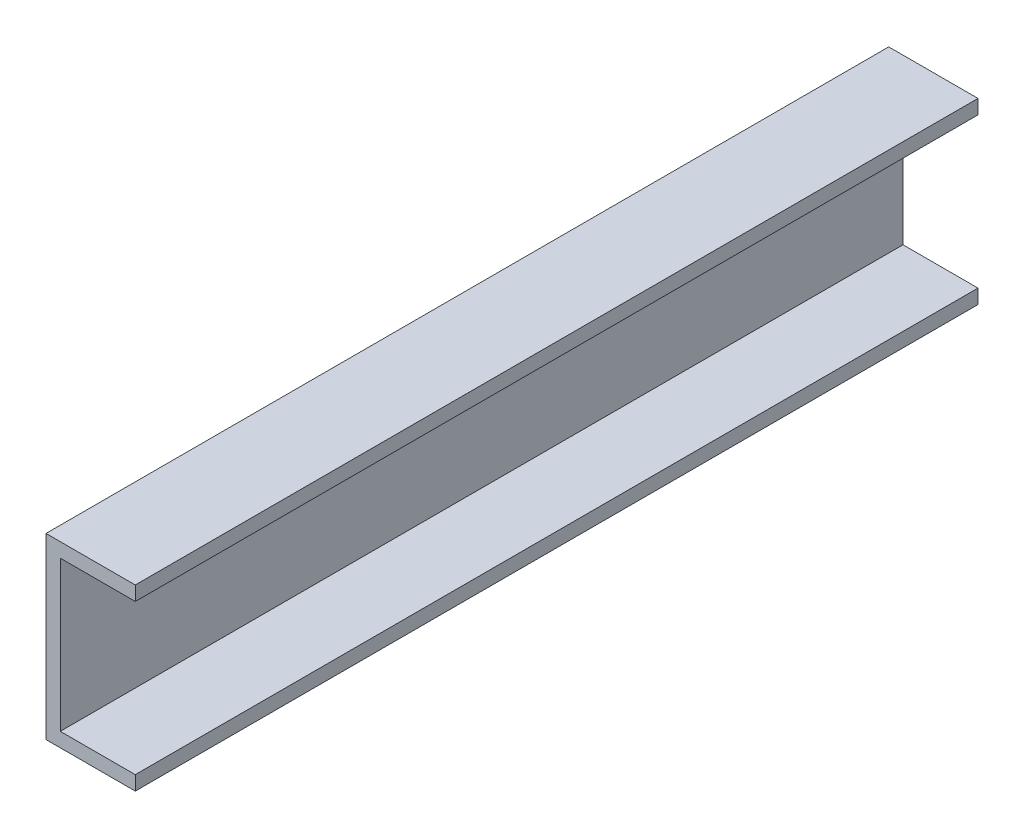
ISO-10303-21;
HEADER;
FILE_DESCRIPTION(('STEP AP214'),'2;1');
FILE_NAME('part.step','',(''),(''),'','','');
FILE_SCHEMA(('AUTOMOTIVE_DESIGN { 1 0 10303 214 1 1 1 1 }'));
ENDSEC;
DATA;
#1=APPLICATION_CONTEXT('core data for automotive mechanical design processes');
#2=APPLICATION_PROTOCOL_DEFINITION('international standard','automotive_design',2000,#1);
#3=PRODUCT_CONTEXT('',#1,'mechanical');
#4=PRODUCT('Part','Part','',(#3));
#5=PRODUCT_RELATED_PRODUCT_CATEGORY('part','',(#4));
#6=PRODUCT_DEFINITION_FORMATION('','',#4);
#7=PRODUCT_DEFINITION_CONTEXT('part definition',#1,'design');
#8=PRODUCT_DEFINITION('design','',#6,#7);
#9=PRODUCT_DEFINITION_SHAPE('','',#8);
#10=(LENGTH_UNIT() NAMED_UNIT(*) SI_UNIT(.MILLI.,.METRE.));
#11=(NAMED_UNIT(*) PLANE_ANGLE_UNIT() SI_UNIT($,.RADIAN.));
#12=(NAMED_UNIT(*) SI_UNIT($,.STERADIAN.) SOLID_ANGLE_UNIT());
#13=UNCERTAINTY_MEASURE_WITH_UNIT(LENGTH_MEASURE(1.E-05),#10,'distance_accuracy_value','');
#14=(GEOMETRIC_REPRESENTATION_CONTEXT(3) GLOBAL_UNCERTAINTY_ASSIGNED_CONTEXT((#13)) GLOBAL_UNIT_ASSIGNED_CONTEXT((#10,
#11,#12)) REPRESENTATION_CONTEXT('',''));
#15=CARTESIAN_POINT('',(0.,0.,0.));
#16=DIRECTION('',(0.,0.,1.));
#17=DIRECTION('',(1.,0.,0.));
#18=AXIS2_PLACEMENT_3D('',#15,#16,#17);
#19=CARTESIAN_POINT('',(0.,0.,472.));
#20=DIRECTION('',(0.,-1.,0.));
#21=DIRECTION('',(0.,0.,-1.));
#22=AXIS2_PLACEMENT_3D('',#19,#20,#21);
#23=PLANE('',#22);
#24=DIRECTION('',(-1.,0.,0.));
#25=VECTOR('',#24,1.);
#26=CARTESIAN_POINT('',(0.,0.,0.));
#27=LINE('',#26,#25);
#28=CARTESIAN_POINT('',(50.,0.,0.));
#29=VERTEX_POINT('',#28);
#30=CARTESIAN_POINT('',(0.,0.,0.));
#31=VERTEX_POINT('',#30);
#32=EDGE_CURVE('E128',#29,#31,#27,.T.);
#33=ORIENTED_EDGE('',*,*,#32,.T.);
#34=DIRECTION('',(0.,0.,-1.));
#35=VECTOR('',#34,1.);
#36=CARTESIAN_POINT('',(0.,0.,472.));
#37=LINE('',#36,#35);
#38=CARTESIAN_POINT('',(0.,0.,472.));
#39=VERTEX_POINT('',#38);
#40=EDGE_CURVE('E11',#39,#31,#37,.T.);
#41=ORIENTED_EDGE('',*,*,#40,.F.);
#42=DIRECTION('',(-1.,0.,0.));
#43=VECTOR('',#42,1.);
#44=CARTESIAN_POINT('',(0.,0.,472.));
#45=LINE('',#44,#43);
#46=CARTESIAN_POINT('',(50.,0.,472.));
#47=VERTEX_POINT('',#46);
#48=EDGE_CURVE('E142',#47,#39,#45,.T.);
#49=ORIENTED_EDGE('',*,*,#48,.F.);
#50=DIRECTION('',(0.,0.,-1.));
#51=VECTOR('',#50,1.);
#52=CARTESIAN_POINT('',(50.,0.,472.));
#53=LINE('',#52,#51);
#54=EDGE_CURVE('E124',#47,#29,#53,.T.);
#55=ORIENTED_EDGE('',*,*,#54,.T.);
#56=EDGE_LOOP('',(#33,#41,#49,#55));
#57=FACE_BOUND('',#56,.T.);
#58=ADVANCED_FACE('F32',(#57),#23,.F.);
#59=CARTESIAN_POINT('',(0.,0.,472.));
#60=DIRECTION('',(1.,0.,0.));
#61=DIRECTION('',(0.,0.,-1.));
#62=AXIS2_PLACEMENT_3D('',#59,#60,#61);
#63=PLANE('',#62);
#64=DIRECTION('',(0.,-1.,0.));
#65=VECTOR('',#64,1.);
#66=CARTESIAN_POINT('',(0.,0.,0.));
#67=LINE('',#66,#65);
#68=CARTESIAN_POINT('',(0.,-100.,0.));
#69=VERTEX_POINT('',#68);
#70=EDGE_CURVE('E131',#31,#69,#67,.T.);
#71=ORIENTED_EDGE('',*,*,#70,.T.);
#72=DIRECTION('',(0.,0.,-1.));
#73=VECTOR('',#72,1.);
#74=CARTESIAN_POINT('',(0.,-100.,472.));
#75=LINE('',#74,#73);
#76=CARTESIAN_POINT('',(0.,-100.,472.));
#77=VERTEX_POINT('',#76);
#78=EDGE_CURVE('E40',#77,#69,#75,.T.);
#79=ORIENTED_EDGE('',*,*,#78,.F.);
#80=DIRECTION('',(0.,-1.,0.));
#81=VECTOR('',#80,1.);
#82=CARTESIAN_POINT('',(0.,0.,472.));
#83=LINE('',#82,#81);
#84=EDGE_CURVE('E91',#39,#77,#83,.T.);
#85=ORIENTED_EDGE('',*,*,#84,.F.);
#86=ORIENTED_EDGE('',*,*,#40,.T.);
#87=EDGE_LOOP('',(#71,#79,#85,#86));
#88=FACE_BOUND('',#87,.T.);
#89=ADVANCED_FACE('F177',(#88),#63,.F.);
#90=CARTESIAN_POINT('',(0.,-100.,472.));
#91=DIRECTION('',(0.,1.,0.));
#92=DIRECTION('',(0.,0.,1.));
#93=AXIS2_PLACEMENT_3D('',#90,#91,#92);
#94=PLANE('',#93);
#95=DIRECTION('',(1.,0.,0.));
#96=VECTOR('',#95,1.);
#97=CARTESIAN_POINT('',(0.,-100.,0.));
#98=LINE('',#97,#96);
#99=CARTESIAN_POINT('',(50.,-100.,0.));
#100=VERTEX_POINT('',#99);
#101=EDGE_CURVE('E133',#69,#100,#98,.T.);
#102=ORIENTED_EDGE('',*,*,#101,.T.);
#103=DIRECTION('',(0.,0.,-1.));
#104=VECTOR('',#103,1.);
#105=CARTESIAN_POINT('',(50.,-100.,472.));
#106=LINE('',#105,#104);
#107=CARTESIAN_POINT('',(50.,-100.,472.));
#108=VERTEX_POINT('',#107);
#109=EDGE_CURVE('E149',#108,#100,#106,.T.);
#110=ORIENTED_EDGE('',*,*,#109,.F.);
#111=DIRECTION('',(1.,0.,0.));
#112=VECTOR('',#111,1.);
#113=CARTESIAN_POINT('',(0.,-100.,472.));
#114=LINE('',#113,#112);
#115=EDGE_CURVE('E157',#77,#108,#114,.T.);
#116=ORIENTED_EDGE('',*,*,#115,.F.);
#117=ORIENTED_EDGE('',*,*,#78,.T.);
#118=EDGE_LOOP('',(#102,#110,#116,#117));
#119=FACE_BOUND('',#118,.T.);
#120=ADVANCED_FACE('F155',(#119),#94,.F.);
#121=CARTESIAN_POINT('',(50.,-100.,472.));
#122=DIRECTION('',(-1.,0.,0.));
#123=DIRECTION('',(0.,0.,1.));
#124=AXIS2_PLACEMENT_3D('',#121,#122,#123);
#125=PLANE('',#124);
#126=DIRECTION('',(0.,1.,0.));
#127=VECTOR('',#126,1.);
#128=CARTESIAN_POINT('',(50.,-100.,0.));
#129=LINE('',#128,#127);
#130=CARTESIAN_POINT('',(50.,-92.,0.));
#131=VERTEX_POINT('',#130);
#132=EDGE_CURVE('E135',#100,#131,#129,.T.);
#133=ORIENTED_EDGE('',*,*,#132,.T.);
#134=DIRECTION('',(0.,0.,-1.));
#135=VECTOR('',#134,1.);
#136=CARTESIAN_POINT('',(50.,-92.,472.));
#137=LINE('',#136,#135);
#138=CARTESIAN_POINT('',(50.,-92.,472.));
#139=VERTEX_POINT('',#138);
#140=EDGE_CURVE('E146',#139,#131,#137,.T.);
#141=ORIENTED_EDGE('',*,*,#140,.F.);
#142=DIRECTION('',(0.,1.,0.));
#143=VECTOR('',#142,1.);
#144=CARTESIAN_POINT('',(50.,-100.,472.));
#145=LINE('',#144,#143);
#146=EDGE_CURVE('E169',#108,#139,#145,.T.);
#147=ORIENTED_EDGE('',*,*,#146,.F.);
#148=ORIENTED_EDGE('',*,*,#109,.T.);
#149=EDGE_LOOP('',(#133,#141,#147,#148));
#150=FACE_BOUND('',#149,.T.);
#151=ADVANCED_FACE('F165',(#150),#125,.F.);
#152=CARTESIAN_POINT('',(50.,-92.,472.));
#153=DIRECTION('',(0.,-1.,0.));
#154=DIRECTION('',(0.,0.,-1.));
#155=AXIS2_PLACEMENT_3D('',#152,#153,#154);
#156=PLANE('',#155);
#157=DIRECTION('',(-1.,0.,0.));
#158=VECTOR('',#157,1.);
#159=CARTESIAN_POINT('',(50.,-92.,0.));
#160=LINE('',#159,#158);
#161=CARTESIAN_POINT('',(8.00000000000001,-92.,0.));
#162=VERTEX_POINT('',#161);
#163=EDGE_CURVE('E137',#131,#162,#160,.T.);
#164=ORIENTED_EDGE('',*,*,#163,.T.);
#165=DIRECTION('',(0.,0.,-1.));
#166=VECTOR('',#165,1.);
#167=CARTESIAN_POINT('',(8.00000000000001,-92.,472.));
#168=LINE('',#167,#166);
#169=CARTESIAN_POINT('',(8.00000000000001,-92.,472.));
#170=VERTEX_POINT('',#169);
#171=EDGE_CURVE('E119',#170,#162,#168,.T.);
#172=ORIENTED_EDGE('',*,*,#171,.F.);
#173=DIRECTION('',(-1.,0.,0.));
#174=VECTOR('',#173,1.);
#175=CARTESIAN_POINT('',(50.,-92.,472.));
#176=LINE('',#175,#174);
#177=EDGE_CURVE('E110',#139,#170,#176,.T.);
#178=ORIENTED_EDGE('',*,*,#177,.F.);
#179=ORIENTED_EDGE('',*,*,#140,.T.);
#180=EDGE_LOOP('',(#164,#172,#178,#179));
#181=FACE_BOUND('',#180,.T.);
#182=ADVANCED_FACE('F168',(#181),#156,.F.);
#183=CARTESIAN_POINT('',(8.00000000000001,-92.,472.));
#184=DIRECTION('',(-1.,0.,0.));
#185=DIRECTION('',(0.,-1.,0.));
#186=AXIS2_PLACEMENT_3D('',#183,#184,#185);
#187=PLANE('',#186);
#188=DIRECTION('',(0.,1.,0.));
#189=VECTOR('',#188,1.);
#190=CARTESIAN_POINT('',(8.00000000000001,-92.,0.));
#191=LINE('',#190,#189);
#192=CARTESIAN_POINT('',(8.00000000000001,-8.00000000000001,0.));
#193=VERTEX_POINT('',#192);
#194=EDGE_CURVE('E118',#162,#193,#191,.T.);
#195=ORIENTED_EDGE('',*,*,#194,.T.);
#196=DIRECTION('',(0.,0.,-1.));
#197=VECTOR('',#196,1.);
#198=CARTESIAN_POINT('',(8.00000000000001,-8.00000000000001,472.));
#199=LINE('',#198,#197);
#200=CARTESIAN_POINT('',(8.00000000000001,-8.00000000000001,472.));
#201=VERTEX_POINT('',#200);
#202=EDGE_CURVE('E115',#201,#193,#199,.T.);
#203=ORIENTED_EDGE('',*,*,#202,.F.);
#204=DIRECTION('',(0.,1.,0.));
#205=VECTOR('',#204,1.);
#206=CARTESIAN_POINT('',(8.00000000000001,-92.,472.));
#207=LINE('',#206,#205);
#208=EDGE_CURVE('E104',#170,#201,#207,.T.);
#209=ORIENTED_EDGE('',*,*,#208,.F.);
#210=ORIENTED_EDGE('',*,*,#171,.T.);
#211=EDGE_LOOP('',(#195,#203,#209,#210));
#212=FACE_BOUND('',#211,.T.);
#213=ADVANCED_FACE('F116',(#212),#187,.F.);
#214=CARTESIAN_POINT('',(50.,-8.00000000000001,472.));
#215=DIRECTION('',(0.,1.,0.));
#216=DIRECTION('',(0.,0.,1.));
#217=AXIS2_PLACEMENT_3D('',#214,#215,#216);
#218=PLANE('',#217);
#219=DIRECTION('',(1.,0.,0.));
#220=VECTOR('',#219,1.);
#221=CARTESIAN_POINT('',(50.,-8.00000000000001,0.));
#222=LINE('',#221,#220);
#223=CARTESIAN_POINT('',(50.,-8.00000000000001,0.));
#224=VERTEX_POINT('',#223);
#225=EDGE_CURVE('E77',#193,#224,#222,.T.);
#226=ORIENTED_EDGE('',*,*,#225,.T.);
#227=DIRECTION('',(0.,0.,-1.));
#228=VECTOR('',#227,1.);
#229=CARTESIAN_POINT('',(50.,-8.00000000000001,472.));
#230=LINE('',#229,#228);
#231=CARTESIAN_POINT('',(50.,-8.00000000000001,472.));
#232=VERTEX_POINT('',#231);
#233=EDGE_CURVE('E120',#232,#224,#230,.T.);
#234=ORIENTED_EDGE('',*,*,#233,.F.);
#235=DIRECTION('',(1.,0.,0.));
#236=VECTOR('',#235,1.);
#237=CARTESIAN_POINT('',(50.,-8.00000000000001,472.));
#238=LINE('',#237,#236);
#239=EDGE_CURVE('E108',#201,#232,#238,.T.);
#240=ORIENTED_EDGE('',*,*,#239,.F.);
#241=ORIENTED_EDGE('',*,*,#202,.T.);
#242=EDGE_LOOP('',(#226,#234,#240,#241));
#243=FACE_BOUND('',#242,.T.);
#244=ADVANCED_FACE('F122',(#243),#218,.F.);
#245=CARTESIAN_POINT('',(50.,0.,472.));
#246=DIRECTION('',(-1.,0.,0.));
#247=DIRECTION('',(0.,0.,1.));
#248=AXIS2_PLACEMENT_3D('',#245,#246,#247);
#249=PLANE('',#248);
#250=DIRECTION('',(0.,1.,0.));
#251=VECTOR('',#250,1.);
#252=CARTESIAN_POINT('',(50.,0.,0.));
#253=LINE('',#252,#251);
#254=EDGE_CURVE('E83',#224,#29,#253,.T.);
#255=ORIENTED_EDGE('',*,*,#254,.T.);
#256=ORIENTED_EDGE('',*,*,#54,.F.);
#257=DIRECTION('',(0.,1.,0.));
#258=VECTOR('',#257,1.);
#259=CARTESIAN_POINT('',(50.,0.,472.));
#260=LINE('',#259,#258);
#261=EDGE_CURVE('E48',#232,#47,#260,.T.);
#262=ORIENTED_EDGE('',*,*,#261,.F.);
#263=ORIENTED_EDGE('',*,*,#233,.T.);
#264=EDGE_LOOP('',(#255,#256,#262,#263));
#265=FACE_BOUND('',#264,.T.);
#266=ADVANCED_FACE('F193',(#265),#249,.F.);
#267=CARTESIAN_POINT('',(0.,0.,472.));
#268=DIRECTION('',(0.,0.,-1.));
#269=DIRECTION('',(-1.,0.,0.));
#270=AXIS2_PLACEMENT_3D('',#267,#268,#269);
#271=PLANE('',#270);
#272=ORIENTED_EDGE('',*,*,#48,.T.);
#273=ORIENTED_EDGE('',*,*,#84,.T.);
#274=ORIENTED_EDGE('',*,*,#115,.T.);
#275=ORIENTED_EDGE('',*,*,#146,.T.);
#276=ORIENTED_EDGE('',*,*,#177,.T.);
#277=ORIENTED_EDGE('',*,*,#208,.T.);
#278=ORIENTED_EDGE('',*,*,#239,.T.);
#279=ORIENTED_EDGE('',*,*,#261,.T.);
#280=EDGE_LOOP('',(#272,#273,#274,#275,#276,#277,#278,#279));
#281=FACE_BOUND('',#280,.T.);
#282=ADVANCED_FACE('F106',(#281),#271,.F.);
#283=CARTESIAN_POINT('',(0.,0.,0.));
#284=DIRECTION('',(0.,0.,-1.));
#285=DIRECTION('',(-1.,0.,0.));
#286=AXIS2_PLACEMENT_3D('',#283,#284,#285);
#287=PLANE('',#286);
#288=ORIENTED_EDGE('',*,*,#32,.F.);
#289=ORIENTED_EDGE('',*,*,#254,.F.);
#290=ORIENTED_EDGE('',*,*,#225,.F.);
#291=ORIENTED_EDGE('',*,*,#194,.F.);
#292=ORIENTED_EDGE('',*,*,#163,.F.);
#293=ORIENTED_EDGE('',*,*,#132,.F.);
#294=ORIENTED_EDGE('',*,*,#101,.F.);
#295=ORIENTED_EDGE('',*,*,#70,.F.);
#296=EDGE_LOOP('',(#288,#289,#290,#291,#292,#293,#294,#295));
#297=FACE_BOUND('',#296,.T.);
#298=ADVANCED_FACE('F161',(#297),#287,.T.);
#299=CLOSED_SHELL('',(#58,#89,#120,#151,#182,#213,#244,#266,#282,#298));
#300=MANIFOLD_SOLID_BREP('B2',#299);
#301=ADVANCED_BREP_SHAPE_REPRESENTATION('',(#18,#300),#14);
#302=SHAPE_DEFINITION_REPRESENTATION(#9,#301);
ENDSEC;
END-ISO-10303-21;
